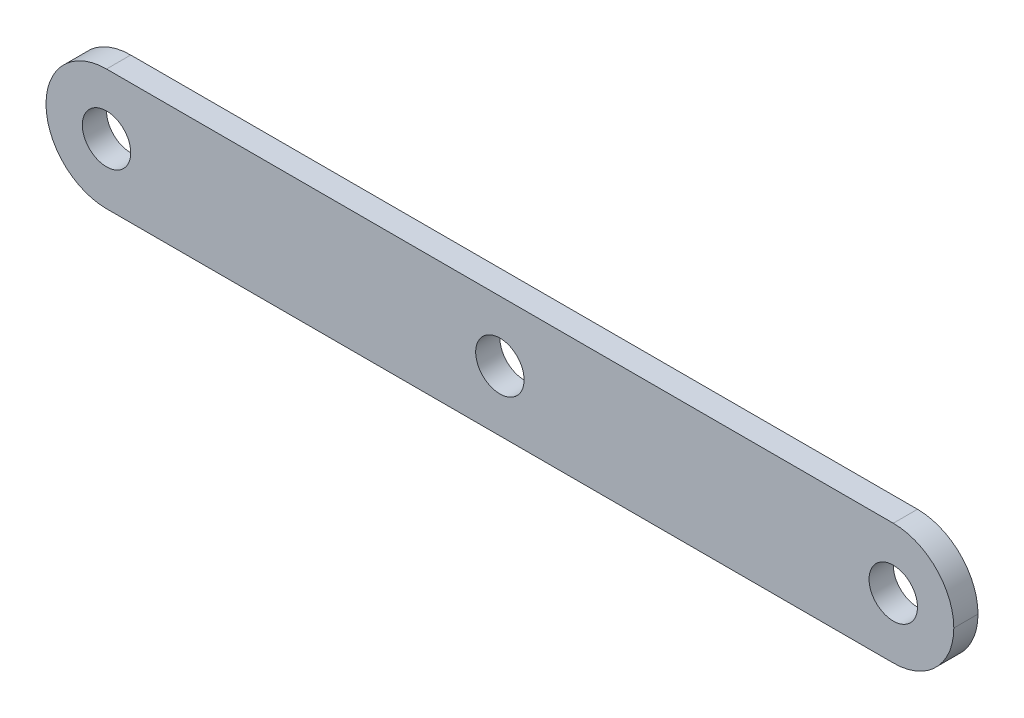
ISO-10303-21;
HEADER;
FILE_DESCRIPTION(('STEP AP214'),'2;1');
FILE_NAME('part.step','',(''),(''),'','','');
FILE_SCHEMA(('AUTOMOTIVE_DESIGN { 1 0 10303 214 1 1 1 1 }'));
ENDSEC;
DATA;
#1=APPLICATION_CONTEXT('core data for automotive mechanical design processes');
#2=APPLICATION_PROTOCOL_DEFINITION('international standard','automotive_design',2000,#1);
#3=PRODUCT_CONTEXT('',#1,'mechanical');
#4=PRODUCT('Part','Part','',(#3));
#5=PRODUCT_RELATED_PRODUCT_CATEGORY('part','',(#4));
#6=PRODUCT_DEFINITION_FORMATION('','',#4);
#7=PRODUCT_DEFINITION_CONTEXT('part definition',#1,'design');
#8=PRODUCT_DEFINITION('design','',#6,#7);
#9=PRODUCT_DEFINITION_SHAPE('','',#8);
#10=(LENGTH_UNIT() NAMED_UNIT(*) SI_UNIT(.MILLI.,.METRE.));
#11=(NAMED_UNIT(*) PLANE_ANGLE_UNIT() SI_UNIT($,.RADIAN.));
#12=(NAMED_UNIT(*) SI_UNIT($,.STERADIAN.) SOLID_ANGLE_UNIT());
#13=UNCERTAINTY_MEASURE_WITH_UNIT(LENGTH_MEASURE(1.E-05),#10,'distance_accuracy_value','');
#14=(GEOMETRIC_REPRESENTATION_CONTEXT(3) GLOBAL_UNCERTAINTY_ASSIGNED_CONTEXT((#13)) GLOBAL_UNIT_ASSIGNED_CONTEXT((#10,
#11,#12)) REPRESENTATION_CONTEXT('',''));
#15=CARTESIAN_POINT('',(0.,0.,0.));
#16=DIRECTION('',(0.,0.,1.));
#17=DIRECTION('',(1.,0.,0.));
#18=AXIS2_PLACEMENT_3D('',#15,#16,#17);
#19=CARTESIAN_POINT('',(-37.5,5.,2.));
#20=DIRECTION('',(0.,-1.,0.));
#21=DIRECTION('',(0.,0.,-1.));
#22=AXIS2_PLACEMENT_3D('',#19,#20,#21);
#23=PLANE('',#22);
#24=DIRECTION('',(-1.,0.,0.));
#25=VECTOR('',#24,1.);
#26=CARTESIAN_POINT('',(-37.5,5.,0.));
#27=LINE('',#26,#25);
#28=CARTESIAN_POINT('',(32.5,5.,0.));
#29=VERTEX_POINT('',#28);
#30=CARTESIAN_POINT('',(-32.5,5.,0.));
#31=VERTEX_POINT('',#30);
#32=EDGE_CURVE('E96',#29,#31,#27,.T.);
#33=ORIENTED_EDGE('',*,*,#32,.T.);
#34=DIRECTION('',(0.,0.,-1.));
#35=VECTOR('',#34,1.);
#36=CARTESIAN_POINT('',(-32.5,5.,2.));
#37=LINE('',#36,#35);
#38=CARTESIAN_POINT('',(-32.5,5.,2.));
#39=VERTEX_POINT('',#38);
#40=EDGE_CURVE('E11',#31,#39,#37,.F.);
#41=ORIENTED_EDGE('',*,*,#40,.T.);
#42=DIRECTION('',(-1.,0.,0.));
#43=VECTOR('',#42,1.);
#44=CARTESIAN_POINT('',(-37.5,5.,2.));
#45=LINE('',#44,#43);
#46=CARTESIAN_POINT('',(32.5,5.,2.));
#47=VERTEX_POINT('',#46);
#48=EDGE_CURVE('E128',#47,#39,#45,.T.);
#49=ORIENTED_EDGE('',*,*,#48,.F.);
#50=DIRECTION('',(0.,0.,-1.));
#51=VECTOR('',#50,1.);
#52=CARTESIAN_POINT('',(32.5,5.,2.));
#53=LINE('',#52,#51);
#54=EDGE_CURVE('E43',#47,#29,#53,.T.);
#55=ORIENTED_EDGE('',*,*,#54,.T.);
#56=EDGE_LOOP('',(#33,#41,#49,#55));
#57=FACE_BOUND('',#56,.T.);
#58=ADVANCED_FACE('F34',(#57),#23,.F.);
#59=CARTESIAN_POINT('',(-37.5,-5.,2.));
#60=DIRECTION('',(0.,1.,0.));
#61=DIRECTION('',(0.,0.,1.));
#62=AXIS2_PLACEMENT_3D('',#59,#60,#61);
#63=PLANE('',#62);
#64=DIRECTION('',(1.,0.,0.));
#65=VECTOR('',#64,1.);
#66=CARTESIAN_POINT('',(-37.5,-5.,0.));
#67=LINE('',#66,#65);
#68=CARTESIAN_POINT('',(-32.5,-5.,0.));
#69=VERTEX_POINT('',#68);
#70=CARTESIAN_POINT('',(32.5,-5.,0.));
#71=VERTEX_POINT('',#70);
#72=EDGE_CURVE('E129',#69,#71,#67,.T.);
#73=ORIENTED_EDGE('',*,*,#72,.T.);
#74=DIRECTION('',(0.,0.,-1.));
#75=VECTOR('',#74,1.);
#76=CARTESIAN_POINT('',(32.5,-5.,2.));
#77=LINE('',#76,#75);
#78=CARTESIAN_POINT('',(32.5,-5.,2.));
#79=VERTEX_POINT('',#78);
#80=EDGE_CURVE('E110',#71,#79,#77,.F.);
#81=ORIENTED_EDGE('',*,*,#80,.T.);
#82=DIRECTION('',(1.,0.,0.));
#83=VECTOR('',#82,1.);
#84=CARTESIAN_POINT('',(-37.5,-5.,2.));
#85=LINE('',#84,#83);
#86=CARTESIAN_POINT('',(-32.5,-5.,2.));
#87=VERTEX_POINT('',#86);
#88=EDGE_CURVE('E99',#87,#79,#85,.T.);
#89=ORIENTED_EDGE('',*,*,#88,.F.);
#90=DIRECTION('',(0.,0.,-1.));
#91=VECTOR('',#90,1.);
#92=CARTESIAN_POINT('',(-32.5,-5.,2.));
#93=LINE('',#92,#91);
#94=EDGE_CURVE('E118',#87,#69,#93,.T.);
#95=ORIENTED_EDGE('',*,*,#94,.T.);
#96=EDGE_LOOP('',(#73,#81,#89,#95));
#97=FACE_BOUND('',#96,.T.);
#98=ADVANCED_FACE('F166',(#97),#63,.F.);
#99=CARTESIAN_POINT('',(0.,0.,2.));
#100=DIRECTION('',(0.,0.,-1.));
#101=DIRECTION('',(-1.,0.,0.));
#102=AXIS2_PLACEMENT_3D('',#99,#100,#101);
#103=PLANE('',#102);
#104=CARTESIAN_POINT('',(32.5,0.,2.));
#105=DIRECTION('',(0.,0.,1.));
#106=DIRECTION('',(-1.,0.,0.));
#107=AXIS2_PLACEMENT_3D('',#104,#105,#106);
#108=CIRCLE('',#107,2.);
#109=CARTESIAN_POINT('',(30.5,0.,2.));
#110=VERTEX_POINT('',#109);
#111=EDGE_CURVE('E148',#110,#110,#108,.T.);
#112=ORIENTED_EDGE('',*,*,#111,.F.);
#113=EDGE_LOOP('',(#112));
#114=FACE_BOUND('',#113,.T.);
#115=CARTESIAN_POINT('',(0.,0.,2.));
#116=DIRECTION('',(0.,0.,1.));
#117=DIRECTION('',(1.,0.,0.));
#118=AXIS2_PLACEMENT_3D('',#115,#116,#117);
#119=CIRCLE('',#118,2.);
#120=CARTESIAN_POINT('',(2.,0.,2.));
#121=VERTEX_POINT('',#120);
#122=EDGE_CURVE('E142',#121,#121,#119,.T.);
#123=ORIENTED_EDGE('',*,*,#122,.F.);
#124=EDGE_LOOP('',(#123));
#125=FACE_BOUND('',#124,.T.);
#126=CARTESIAN_POINT('',(-32.5,0.,2.));
#127=DIRECTION('',(0.,0.,1.));
#128=DIRECTION('',(1.,0.,0.));
#129=AXIS2_PLACEMENT_3D('',#126,#127,#128);
#130=CIRCLE('',#129,2.);
#131=CARTESIAN_POINT('',(-30.5,0.,2.));
#132=VERTEX_POINT('',#131);
#133=EDGE_CURVE('E134',#132,#132,#130,.T.);
#134=ORIENTED_EDGE('',*,*,#133,.F.);
#135=EDGE_LOOP('',(#134));
#136=FACE_BOUND('',#135,.T.);
#137=CARTESIAN_POINT('',(-32.5,0.,2.));
#138=DIRECTION('',(0.,0.,-1.));
#139=DIRECTION('',(-1.,0.,0.));
#140=AXIS2_PLACEMENT_3D('',#137,#138,#139);
#141=CIRCLE('',#140,5.);
#142=CARTESIAN_POINT('',(-37.5,0.,2.));
#143=VERTEX_POINT('',#142);
#144=EDGE_CURVE('E51',#39,#143,#141,.F.);
#145=ORIENTED_EDGE('',*,*,#144,.T.);
#146=CARTESIAN_POINT('',(-32.5,0.,2.));
#147=DIRECTION('',(0.,0.,-1.));
#148=DIRECTION('',(-1.,0.,0.));
#149=AXIS2_PLACEMENT_3D('',#146,#147,#148);
#150=CIRCLE('',#149,5.);
#151=EDGE_CURVE('E126',#143,#87,#150,.F.);
#152=ORIENTED_EDGE('',*,*,#151,.T.);
#153=ORIENTED_EDGE('',*,*,#88,.T.);
#154=CARTESIAN_POINT('',(32.5,0.,2.));
#155=DIRECTION('',(0.,0.,-1.));
#156=DIRECTION('',(-1.,0.,0.));
#157=AXIS2_PLACEMENT_3D('',#154,#155,#156);
#158=CIRCLE('',#157,5.);
#159=CARTESIAN_POINT('',(37.5,0.,2.));
#160=VERTEX_POINT('',#159);
#161=EDGE_CURVE('E123',#79,#160,#158,.F.);
#162=ORIENTED_EDGE('',*,*,#161,.T.);
#163=CARTESIAN_POINT('',(32.5,0.,2.));
#164=DIRECTION('',(0.,0.,-1.));
#165=DIRECTION('',(-1.,0.,0.));
#166=AXIS2_PLACEMENT_3D('',#163,#164,#165);
#167=CIRCLE('',#166,5.);
#168=EDGE_CURVE('E105',#160,#47,#167,.F.);
#169=ORIENTED_EDGE('',*,*,#168,.T.);
#170=ORIENTED_EDGE('',*,*,#48,.T.);
#171=EDGE_LOOP('',(#145,#152,#153,#162,#169,#170));
#172=FACE_BOUND('',#171,.T.);
#173=ADVANCED_FACE('F163',(#114,#125,#136,#172),#103,.F.);
#174=CARTESIAN_POINT('',(0.,0.,0.));
#175=DIRECTION('',(0.,0.,-1.));
#176=DIRECTION('',(-1.,0.,0.));
#177=AXIS2_PLACEMENT_3D('',#174,#175,#176);
#178=PLANE('',#177);
#179=CARTESIAN_POINT('',(32.5,0.,0.));
#180=DIRECTION('',(0.,0.,1.));
#181=DIRECTION('',(-1.,0.,0.));
#182=AXIS2_PLACEMENT_3D('',#179,#180,#181);
#183=CIRCLE('',#182,2.);
#184=CARTESIAN_POINT('',(30.5,0.,0.));
#185=VERTEX_POINT('',#184);
#186=EDGE_CURVE('E139',#185,#185,#183,.T.);
#187=ORIENTED_EDGE('',*,*,#186,.T.);
#188=EDGE_LOOP('',(#187));
#189=FACE_BOUND('',#188,.T.);
#190=CARTESIAN_POINT('',(0.,0.,0.));
#191=DIRECTION('',(0.,0.,1.));
#192=DIRECTION('',(1.,0.,0.));
#193=AXIS2_PLACEMENT_3D('',#190,#191,#192);
#194=CIRCLE('',#193,2.);
#195=CARTESIAN_POINT('',(2.,0.,0.));
#196=VERTEX_POINT('',#195);
#197=EDGE_CURVE('E145',#196,#196,#194,.T.);
#198=ORIENTED_EDGE('',*,*,#197,.T.);
#199=EDGE_LOOP('',(#198));
#200=FACE_BOUND('',#199,.T.);
#201=CARTESIAN_POINT('',(-32.5,0.,0.));
#202=DIRECTION('',(0.,0.,1.));
#203=DIRECTION('',(1.,0.,0.));
#204=AXIS2_PLACEMENT_3D('',#201,#202,#203);
#205=CIRCLE('',#204,2.);
#206=CARTESIAN_POINT('',(-30.5,0.,0.));
#207=VERTEX_POINT('',#206);
#208=EDGE_CURVE('E138',#207,#207,#205,.T.);
#209=ORIENTED_EDGE('',*,*,#208,.T.);
#210=EDGE_LOOP('',(#209));
#211=FACE_BOUND('',#210,.T.);
#212=ORIENTED_EDGE('',*,*,#72,.F.);
#213=CARTESIAN_POINT('',(-32.5,0.,0.));
#214=DIRECTION('',(0.,0.,-1.));
#215=DIRECTION('',(-1.,0.,0.));
#216=AXIS2_PLACEMENT_3D('',#213,#214,#215);
#217=CIRCLE('',#216,5.);
#218=CARTESIAN_POINT('',(-37.5,0.,0.));
#219=VERTEX_POINT('',#218);
#220=EDGE_CURVE('E113',#69,#219,#217,.T.);
#221=ORIENTED_EDGE('',*,*,#220,.T.);
#222=CARTESIAN_POINT('',(-32.5,0.,0.));
#223=DIRECTION('',(0.,0.,-1.));
#224=DIRECTION('',(-1.,0.,0.));
#225=AXIS2_PLACEMENT_3D('',#222,#223,#224);
#226=CIRCLE('',#225,5.);
#227=EDGE_CURVE('E111',#219,#31,#226,.T.);
#228=ORIENTED_EDGE('',*,*,#227,.T.);
#229=ORIENTED_EDGE('',*,*,#32,.F.);
#230=CARTESIAN_POINT('',(32.5,0.,0.));
#231=DIRECTION('',(0.,0.,-1.));
#232=DIRECTION('',(-1.,0.,0.));
#233=AXIS2_PLACEMENT_3D('',#230,#231,#232);
#234=CIRCLE('',#233,5.);
#235=CARTESIAN_POINT('',(37.5,0.,0.));
#236=VERTEX_POINT('',#235);
#237=EDGE_CURVE('E89',#29,#236,#234,.T.);
#238=ORIENTED_EDGE('',*,*,#237,.T.);
#239=CARTESIAN_POINT('',(32.5,0.,0.));
#240=DIRECTION('',(0.,0.,-1.));
#241=DIRECTION('',(-1.,0.,0.));
#242=AXIS2_PLACEMENT_3D('',#239,#240,#241);
#243=CIRCLE('',#242,5.);
#244=EDGE_CURVE('E94',#236,#71,#243,.T.);
#245=ORIENTED_EDGE('',*,*,#244,.T.);
#246=EDGE_LOOP('',(#212,#221,#228,#229,#238,#245));
#247=FACE_BOUND('',#246,.T.);
#248=ADVANCED_FACE('F92',(#189,#200,#211,#247),#178,.T.);
#249=CARTESIAN_POINT('',(32.5,0.,2.));
#250=DIRECTION('',(0.,0.,-1.));
#251=DIRECTION('',(-1.,0.,0.));
#252=AXIS2_PLACEMENT_3D('',#249,#250,#251);
#253=CYLINDRICAL_SURFACE('',#252,5.);
#254=ORIENTED_EDGE('',*,*,#54,.F.);
#255=ORIENTED_EDGE('',*,*,#168,.F.);
#256=DIRECTION('',(0.,0.,-1.));
#257=VECTOR('',#256,1.);
#258=CARTESIAN_POINT('',(37.5,0.,2.));
#259=LINE('',#258,#257);
#260=EDGE_CURVE('E103',#236,#160,#259,.F.);
#261=ORIENTED_EDGE('',*,*,#260,.F.);
#262=ORIENTED_EDGE('',*,*,#237,.F.);
#263=EDGE_LOOP('',(#254,#255,#261,#262));
#264=FACE_BOUND('',#263,.T.);
#265=ADVANCED_FACE('F104',(#264),#253,.T.);
#266=CARTESIAN_POINT('',(32.5,0.,2.));
#267=DIRECTION('',(0.,0.,-1.));
#268=DIRECTION('',(-1.,0.,0.));
#269=AXIS2_PLACEMENT_3D('',#266,#267,#268);
#270=CYLINDRICAL_SURFACE('',#269,5.);
#271=ORIENTED_EDGE('',*,*,#161,.F.);
#272=ORIENTED_EDGE('',*,*,#80,.F.);
#273=ORIENTED_EDGE('',*,*,#244,.F.);
#274=ORIENTED_EDGE('',*,*,#260,.T.);
#275=EDGE_LOOP('',(#271,#272,#273,#274));
#276=FACE_BOUND('',#275,.T.);
#277=ADVANCED_FACE('F108',(#276),#270,.T.);
#278=CARTESIAN_POINT('',(-32.5,0.,2.));
#279=DIRECTION('',(0.,0.,-1.));
#280=DIRECTION('',(-1.,0.,0.));
#281=AXIS2_PLACEMENT_3D('',#278,#279,#280);
#282=CYLINDRICAL_SURFACE('',#281,5.);
#283=DIRECTION('',(0.,0.,-1.));
#284=VECTOR('',#283,1.);
#285=CARTESIAN_POINT('',(-37.5,0.,2.));
#286=LINE('',#285,#284);
#287=EDGE_CURVE('E38',#143,#219,#286,.T.);
#288=ORIENTED_EDGE('',*,*,#287,.F.);
#289=ORIENTED_EDGE('',*,*,#144,.F.);
#290=ORIENTED_EDGE('',*,*,#40,.F.);
#291=ORIENTED_EDGE('',*,*,#227,.F.);
#292=EDGE_LOOP('',(#288,#289,#290,#291));
#293=FACE_BOUND('',#292,.T.);
#294=ADVANCED_FACE('F36',(#293),#282,.T.);
#295=CARTESIAN_POINT('',(-32.5,0.,2.));
#296=DIRECTION('',(0.,0.,-1.));
#297=DIRECTION('',(-1.,0.,0.));
#298=AXIS2_PLACEMENT_3D('',#295,#296,#297);
#299=CYLINDRICAL_SURFACE('',#298,5.);
#300=ORIENTED_EDGE('',*,*,#151,.F.);
#301=ORIENTED_EDGE('',*,*,#287,.T.);
#302=ORIENTED_EDGE('',*,*,#220,.F.);
#303=ORIENTED_EDGE('',*,*,#94,.F.);
#304=EDGE_LOOP('',(#300,#301,#302,#303));
#305=FACE_BOUND('',#304,.T.);
#306=ADVANCED_FACE('F174',(#305),#299,.T.);
#307=CARTESIAN_POINT('',(-32.5,0.,0.));
#308=DIRECTION('',(0.,0.,1.));
#309=DIRECTION('',(1.,0.,0.));
#310=AXIS2_PLACEMENT_3D('',#307,#308,#309);
#311=CYLINDRICAL_SURFACE('',#310,2.);
#312=ORIENTED_EDGE('',*,*,#208,.F.);
#313=EDGE_LOOP('',(#312));
#314=FACE_BOUND('',#313,.T.);
#315=ORIENTED_EDGE('',*,*,#133,.T.);
#316=EDGE_LOOP('',(#315));
#317=FACE_BOUND('',#316,.T.);
#318=ADVANCED_FACE('F172',(#314,#317),#311,.F.);
#319=CARTESIAN_POINT('',(0.,0.,0.));
#320=DIRECTION('',(0.,0.,1.));
#321=DIRECTION('',(1.,0.,0.));
#322=AXIS2_PLACEMENT_3D('',#319,#320,#321);
#323=CYLINDRICAL_SURFACE('',#322,2.);
#324=ORIENTED_EDGE('',*,*,#197,.F.);
#325=EDGE_LOOP('',(#324));
#326=FACE_BOUND('',#325,.T.);
#327=ORIENTED_EDGE('',*,*,#122,.T.);
#328=EDGE_LOOP('',(#327));
#329=FACE_BOUND('',#328,.T.);
#330=ADVANCED_FACE('F159',(#326,#329),#323,.F.);
#331=CARTESIAN_POINT('',(32.5,0.,0.));
#332=DIRECTION('',(0.,0.,1.));
#333=DIRECTION('',(1.,0.,0.));
#334=AXIS2_PLACEMENT_3D('',#331,#332,#333);
#335=CYLINDRICAL_SURFACE('',#334,2.);
#336=ORIENTED_EDGE('',*,*,#186,.F.);
#337=EDGE_LOOP('',(#336));
#338=FACE_BOUND('',#337,.T.);
#339=ORIENTED_EDGE('',*,*,#111,.T.);
#340=EDGE_LOOP('',(#339));
#341=FACE_BOUND('',#340,.T.);
#342=ADVANCED_FACE('F156',(#338,#341),#335,.F.);
#343=CLOSED_SHELL('',(#58,#98,#173,#248,#265,#277,#294,#306,#318,#330,#342));
#344=MANIFOLD_SOLID_BREP('B2',#343);
#345=ADVANCED_BREP_SHAPE_REPRESENTATION('',(#18,#344),#14);
#346=SHAPE_DEFINITION_REPRESENTATION(#9,#345);
ENDSEC;
END-ISO-10303-21;
